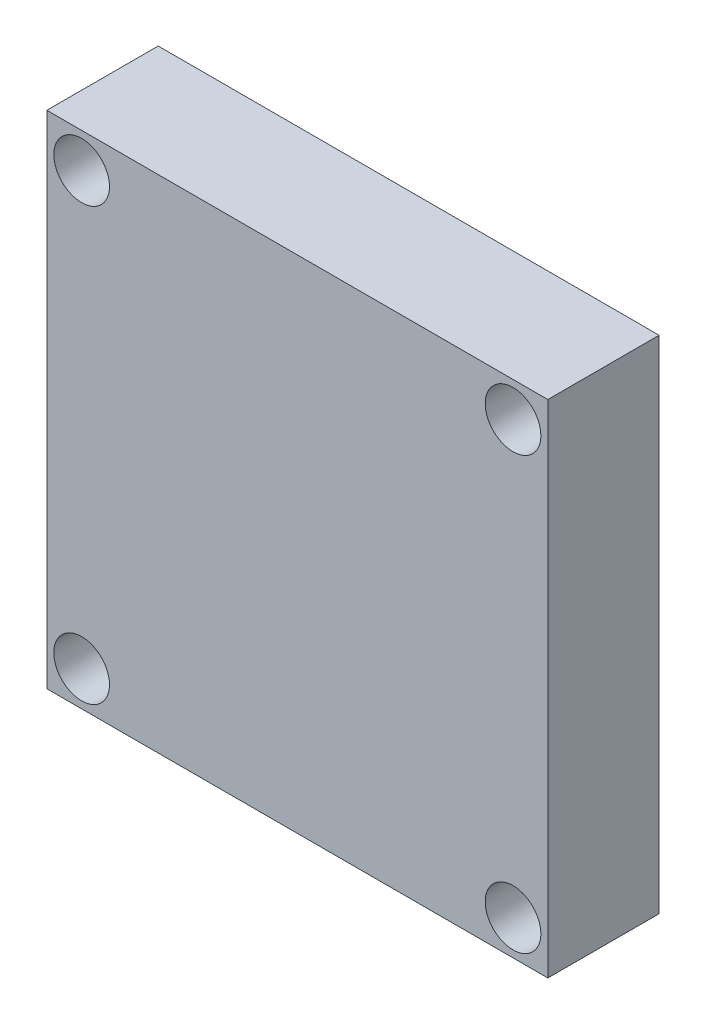
ISO-10303-21;
HEADER;
FILE_DESCRIPTION(('STEP AP214'),'2;1');
FILE_NAME('part.step','',(''),(''),'','','');
FILE_SCHEMA(('AUTOMOTIVE_DESIGN { 1 0 10303 214 1 1 1 1 }'));
ENDSEC;
DATA;
#1=APPLICATION_CONTEXT('core data for automotive mechanical design processes');
#2=APPLICATION_PROTOCOL_DEFINITION('international standard','automotive_design',2000,#1);
#3=PRODUCT_CONTEXT('',#1,'mechanical');
#4=PRODUCT('Part','Part','',(#3));
#5=PRODUCT_RELATED_PRODUCT_CATEGORY('part','',(#4));
#6=PRODUCT_DEFINITION_FORMATION('','',#4);
#7=PRODUCT_DEFINITION_CONTEXT('part definition',#1,'design');
#8=PRODUCT_DEFINITION('design','',#6,#7);
#9=PRODUCT_DEFINITION_SHAPE('','',#8);
#10=(LENGTH_UNIT() NAMED_UNIT(*) SI_UNIT(.MILLI.,.METRE.));
#11=(NAMED_UNIT(*) PLANE_ANGLE_UNIT() SI_UNIT($,.RADIAN.));
#12=(NAMED_UNIT(*) SI_UNIT($,.STERADIAN.) SOLID_ANGLE_UNIT());
#13=UNCERTAINTY_MEASURE_WITH_UNIT(LENGTH_MEASURE(1.E-05),#10,'distance_accuracy_value','');
#14=(GEOMETRIC_REPRESENTATION_CONTEXT(3) GLOBAL_UNCERTAINTY_ASSIGNED_CONTEXT((#13)) GLOBAL_UNIT_ASSIGNED_CONTEXT((#10,
#11,#12)) REPRESENTATION_CONTEXT('',''));
#15=CARTESIAN_POINT('',(0.,0.,0.));
#16=DIRECTION('',(0.,0.,1.));
#17=DIRECTION('',(1.,0.,0.));
#18=AXIS2_PLACEMENT_3D('',#15,#16,#17);
#19=CARTESIAN_POINT('',(0.,-18.,4.));
#20=DIRECTION('',(0.,1.,0.));
#21=DIRECTION('',(0.,0.,1.));
#22=AXIS2_PLACEMENT_3D('',#19,#20,#21);
#23=PLANE('',#22);
#24=DIRECTION('',(1.,0.,0.));
#25=VECTOR('',#24,1.);
#26=CARTESIAN_POINT('',(0.,-18.,-4.));
#27=LINE('',#26,#25);
#28=CARTESIAN_POINT('',(-18.,-18.,-4.));
#29=VERTEX_POINT('',#28);
#30=CARTESIAN_POINT('',(18.,-18.,-4.));
#31=VERTEX_POINT('',#30);
#32=EDGE_CURVE('E118',#29,#31,#27,.T.);
#33=ORIENTED_EDGE('',*,*,#32,.T.);
#34=DIRECTION('',(0.,0.,-1.));
#35=VECTOR('',#34,1.);
#36=CARTESIAN_POINT('',(18.,-18.,4.));
#37=LINE('',#36,#35);
#38=CARTESIAN_POINT('',(18.,-18.,4.));
#39=VERTEX_POINT('',#38);
#40=EDGE_CURVE('E11',#39,#31,#37,.T.);
#41=ORIENTED_EDGE('',*,*,#40,.F.);
#42=DIRECTION('',(1.,0.,0.));
#43=VECTOR('',#42,1.);
#44=CARTESIAN_POINT('',(0.,-18.,4.));
#45=LINE('',#44,#43);
#46=CARTESIAN_POINT('',(-18.,-18.,4.));
#47=VERTEX_POINT('',#46);
#48=EDGE_CURVE('E91',#47,#39,#45,.T.);
#49=ORIENTED_EDGE('',*,*,#48,.F.);
#50=DIRECTION('',(0.,0.,-1.));
#51=VECTOR('',#50,1.);
#52=CARTESIAN_POINT('',(-18.,-18.,4.));
#53=LINE('',#52,#51);
#54=EDGE_CURVE('E58',#47,#29,#53,.T.);
#55=ORIENTED_EDGE('',*,*,#54,.T.);
#56=EDGE_LOOP('',(#33,#41,#49,#55));
#57=FACE_BOUND('',#56,.T.);
#58=ADVANCED_FACE('F43',(#57),#23,.F.);
#59=CARTESIAN_POINT('',(18.,0.,4.));
#60=DIRECTION('',(-1.,0.,0.));
#61=DIRECTION('',(0.,-1.,0.));
#62=AXIS2_PLACEMENT_3D('',#59,#60,#61);
#63=PLANE('',#62);
#64=DIRECTION('',(0.,1.,0.));
#65=VECTOR('',#64,1.);
#66=CARTESIAN_POINT('',(18.,0.,-4.));
#67=LINE('',#66,#65);
#68=CARTESIAN_POINT('',(18.,18.,-4.));
#69=VERTEX_POINT('',#68);
#70=EDGE_CURVE('E98',#31,#69,#67,.T.);
#71=ORIENTED_EDGE('',*,*,#70,.T.);
#72=DIRECTION('',(0.,0.,-1.));
#73=VECTOR('',#72,1.);
#74=CARTESIAN_POINT('',(18.,18.,4.));
#75=LINE('',#74,#73);
#76=CARTESIAN_POINT('',(18.,18.,4.));
#77=VERTEX_POINT('',#76);
#78=EDGE_CURVE('E55',#77,#69,#75,.T.);
#79=ORIENTED_EDGE('',*,*,#78,.F.);
#80=DIRECTION('',(0.,1.,0.));
#81=VECTOR('',#80,1.);
#82=CARTESIAN_POINT('',(18.,0.,4.));
#83=LINE('',#82,#81);
#84=EDGE_CURVE('E82',#39,#77,#83,.T.);
#85=ORIENTED_EDGE('',*,*,#84,.F.);
#86=ORIENTED_EDGE('',*,*,#40,.T.);
#87=EDGE_LOOP('',(#71,#79,#85,#86));
#88=FACE_BOUND('',#87,.T.);
#89=ADVANCED_FACE('F100',(#88),#63,.F.);
#90=CARTESIAN_POINT('',(0.,18.,4.));
#91=DIRECTION('',(0.,1.,0.));
#92=DIRECTION('',(0.,0.,1.));
#93=AXIS2_PLACEMENT_3D('',#90,#91,#92);
#94=PLANE('',#93);
#95=DIRECTION('',(1.,0.,0.));
#96=VECTOR('',#95,1.);
#97=CARTESIAN_POINT('',(0.,18.,-4.));
#98=LINE('',#97,#96);
#99=CARTESIAN_POINT('',(-18.,18.,-4.));
#100=VERTEX_POINT('',#99);
#101=EDGE_CURVE('E121',#100,#69,#98,.T.);
#102=ORIENTED_EDGE('',*,*,#101,.F.);
#103=DIRECTION('',(0.,0.,-1.));
#104=VECTOR('',#103,1.);
#105=CARTESIAN_POINT('',(-18.,18.,4.));
#106=LINE('',#105,#104);
#107=CARTESIAN_POINT('',(-18.,18.,4.));
#108=VERTEX_POINT('',#107);
#109=EDGE_CURVE('E74',#108,#100,#106,.T.);
#110=ORIENTED_EDGE('',*,*,#109,.F.);
#111=DIRECTION('',(1.,0.,0.));
#112=VECTOR('',#111,1.);
#113=CARTESIAN_POINT('',(0.,18.,4.));
#114=LINE('',#113,#112);
#115=EDGE_CURVE('E95',#108,#77,#114,.T.);
#116=ORIENTED_EDGE('',*,*,#115,.T.);
#117=ORIENTED_EDGE('',*,*,#78,.T.);
#118=EDGE_LOOP('',(#102,#110,#116,#117));
#119=FACE_BOUND('',#118,.T.);
#120=ADVANCED_FACE('F101',(#119),#94,.T.);
#121=CARTESIAN_POINT('',(-15.5,15.5,4.));
#122=DIRECTION('',(0.,0.,-1.));
#123=DIRECTION('',(-1.,0.,0.));
#124=AXIS2_PLACEMENT_3D('',#121,#122,#123);
#125=CYLINDRICAL_SURFACE('',#124,2.);
#126=CARTESIAN_POINT('',(-15.5,15.5,4.));
#127=DIRECTION('',(0.,0.,1.));
#128=DIRECTION('',(1.,0.,0.));
#129=AXIS2_PLACEMENT_3D('',#126,#127,#128);
#130=CIRCLE('',#129,2.);
#131=CARTESIAN_POINT('',(-13.5,15.5,4.));
#132=VERTEX_POINT('',#131);
#133=EDGE_CURVE('E143',#132,#132,#130,.T.);
#134=ORIENTED_EDGE('',*,*,#133,.T.);
#135=EDGE_LOOP('',(#134));
#136=FACE_BOUND('',#135,.T.);
#137=CARTESIAN_POINT('',(-15.5,15.5,-4.));
#138=DIRECTION('',(0.,0.,1.));
#139=DIRECTION('',(1.,0.,0.));
#140=AXIS2_PLACEMENT_3D('',#137,#138,#139);
#141=CIRCLE('',#140,2.);
#142=CARTESIAN_POINT('',(-13.5,15.5,-4.));
#143=VERTEX_POINT('',#142);
#144=EDGE_CURVE('E119',#143,#143,#141,.T.);
#145=ORIENTED_EDGE('',*,*,#144,.F.);
#146=EDGE_LOOP('',(#145));
#147=FACE_BOUND('',#146,.T.);
#148=ADVANCED_FACE('F144',(#136,#147),#125,.F.);
#149=CARTESIAN_POINT('',(15.5,15.5,4.));
#150=DIRECTION('',(0.,0.,-1.));
#151=DIRECTION('',(-1.,0.,0.));
#152=AXIS2_PLACEMENT_3D('',#149,#150,#151);
#153=CYLINDRICAL_SURFACE('',#152,2.00000000000001);
#154=CARTESIAN_POINT('',(15.5,15.5,4.));
#155=DIRECTION('',(0.,0.,1.));
#156=DIRECTION('',(1.,0.,0.));
#157=AXIS2_PLACEMENT_3D('',#154,#155,#156);
#158=CIRCLE('',#157,2.00000000000001);
#159=CARTESIAN_POINT('',(17.5,15.5,4.));
#160=VERTEX_POINT('',#159);
#161=EDGE_CURVE('E139',#160,#160,#158,.T.);
#162=ORIENTED_EDGE('',*,*,#161,.T.);
#163=EDGE_LOOP('',(#162));
#164=FACE_BOUND('',#163,.T.);
#165=CARTESIAN_POINT('',(15.5,15.5,-4.));
#166=DIRECTION('',(0.,0.,1.));
#167=DIRECTION('',(1.,0.,0.));
#168=AXIS2_PLACEMENT_3D('',#165,#166,#167);
#169=CIRCLE('',#168,2.00000000000001);
#170=CARTESIAN_POINT('',(17.5,15.5,-4.));
#171=VERTEX_POINT('',#170);
#172=EDGE_CURVE('E114',#171,#171,#169,.T.);
#173=ORIENTED_EDGE('',*,*,#172,.F.);
#174=EDGE_LOOP('',(#173));
#175=FACE_BOUND('',#174,.T.);
#176=ADVANCED_FACE('F174',(#164,#175),#153,.F.);
#177=CARTESIAN_POINT('',(15.5,-15.5,4.));
#178=DIRECTION('',(0.,0.,-1.));
#179=DIRECTION('',(-1.,0.,0.));
#180=AXIS2_PLACEMENT_3D('',#177,#178,#179);
#181=CYLINDRICAL_SURFACE('',#180,2.00000000000001);
#182=CARTESIAN_POINT('',(15.5,-15.5,4.));
#183=DIRECTION('',(0.,0.,1.));
#184=DIRECTION('',(1.,0.,0.));
#185=AXIS2_PLACEMENT_3D('',#182,#183,#184);
#186=CIRCLE('',#185,2.00000000000001);
#187=CARTESIAN_POINT('',(17.5,-15.5,4.));
#188=VERTEX_POINT('',#187);
#189=EDGE_CURVE('E134',#188,#188,#186,.T.);
#190=ORIENTED_EDGE('',*,*,#189,.T.);
#191=EDGE_LOOP('',(#190));
#192=FACE_BOUND('',#191,.T.);
#193=CARTESIAN_POINT('',(15.5,-15.5,-4.));
#194=DIRECTION('',(0.,0.,1.));
#195=DIRECTION('',(1.,0.,0.));
#196=AXIS2_PLACEMENT_3D('',#193,#194,#195);
#197=CIRCLE('',#196,2.00000000000001);
#198=CARTESIAN_POINT('',(17.5,-15.5,-4.));
#199=VERTEX_POINT('',#198);
#200=EDGE_CURVE('E109',#199,#199,#197,.T.);
#201=ORIENTED_EDGE('',*,*,#200,.F.);
#202=EDGE_LOOP('',(#201));
#203=FACE_BOUND('',#202,.T.);
#204=ADVANCED_FACE('F175',(#192,#203),#181,.F.);
#205=CARTESIAN_POINT('',(-15.5,-15.5,4.));
#206=DIRECTION('',(0.,0.,-1.));
#207=DIRECTION('',(-1.,0.,0.));
#208=AXIS2_PLACEMENT_3D('',#205,#206,#207);
#209=CYLINDRICAL_SURFACE('',#208,2.);
#210=CARTESIAN_POINT('',(-15.5,-15.5,4.));
#211=DIRECTION('',(0.,0.,1.));
#212=DIRECTION('',(1.,0.,0.));
#213=AXIS2_PLACEMENT_3D('',#210,#211,#212);
#214=CIRCLE('',#213,2.);
#215=CARTESIAN_POINT('',(-13.5,-15.5,4.));
#216=VERTEX_POINT('',#215);
#217=EDGE_CURVE('E130',#216,#216,#214,.T.);
#218=ORIENTED_EDGE('',*,*,#217,.T.);
#219=EDGE_LOOP('',(#218));
#220=FACE_BOUND('',#219,.T.);
#221=CARTESIAN_POINT('',(-15.5,-15.5,-4.));
#222=DIRECTION('',(0.,0.,1.));
#223=DIRECTION('',(1.,0.,0.));
#224=AXIS2_PLACEMENT_3D('',#221,#222,#223);
#225=CIRCLE('',#224,2.);
#226=CARTESIAN_POINT('',(-13.5,-15.5,-4.));
#227=VERTEX_POINT('',#226);
#228=EDGE_CURVE('E110',#227,#227,#225,.T.);
#229=ORIENTED_EDGE('',*,*,#228,.F.);
#230=EDGE_LOOP('',(#229));
#231=FACE_BOUND('',#230,.T.);
#232=ADVANCED_FACE('F44',(#220,#231),#209,.F.);
#233=CARTESIAN_POINT('',(-18.,0.,4.));
#234=DIRECTION('',(-1.,0.,0.));
#235=DIRECTION('',(0.,-1.,0.));
#236=AXIS2_PLACEMENT_3D('',#233,#234,#235);
#237=PLANE('',#236);
#238=DIRECTION('',(0.,1.,0.));
#239=VECTOR('',#238,1.);
#240=CARTESIAN_POINT('',(-18.,0.,-4.));
#241=LINE('',#240,#239);
#242=EDGE_CURVE('E123',#29,#100,#241,.T.);
#243=ORIENTED_EDGE('',*,*,#242,.F.);
#244=ORIENTED_EDGE('',*,*,#54,.F.);
#245=DIRECTION('',(0.,1.,0.));
#246=VECTOR('',#245,1.);
#247=CARTESIAN_POINT('',(-18.,0.,4.));
#248=LINE('',#247,#246);
#249=EDGE_CURVE('E105',#47,#108,#248,.T.);
#250=ORIENTED_EDGE('',*,*,#249,.T.);
#251=ORIENTED_EDGE('',*,*,#109,.T.);
#252=EDGE_LOOP('',(#243,#244,#250,#251));
#253=FACE_BOUND('',#252,.T.);
#254=ADVANCED_FACE('F147',(#253),#237,.T.);
#255=CARTESIAN_POINT('',(0.,0.,4.));
#256=DIRECTION('',(0.,0.,1.));
#257=DIRECTION('',(1.,0.,0.));
#258=AXIS2_PLACEMENT_3D('',#255,#256,#257);
#259=PLANE('',#258);
#260=ORIENTED_EDGE('',*,*,#217,.F.);
#261=EDGE_LOOP('',(#260));
#262=FACE_BOUND('',#261,.T.);
#263=ORIENTED_EDGE('',*,*,#189,.F.);
#264=EDGE_LOOP('',(#263));
#265=FACE_BOUND('',#264,.T.);
#266=ORIENTED_EDGE('',*,*,#161,.F.);
#267=EDGE_LOOP('',(#266));
#268=FACE_BOUND('',#267,.T.);
#269=ORIENTED_EDGE('',*,*,#133,.F.);
#270=EDGE_LOOP('',(#269));
#271=FACE_BOUND('',#270,.T.);
#272=ORIENTED_EDGE('',*,*,#48,.T.);
#273=ORIENTED_EDGE('',*,*,#84,.T.);
#274=ORIENTED_EDGE('',*,*,#115,.F.);
#275=ORIENTED_EDGE('',*,*,#249,.F.);
#276=EDGE_LOOP('',(#272,#273,#274,#275));
#277=FACE_BOUND('',#276,.T.);
#278=ADVANCED_FACE('F90',(#262,#265,#268,#271,#277),#259,.T.);
#279=CARTESIAN_POINT('',(0.,0.,-4.));
#280=DIRECTION('',(0.,0.,1.));
#281=DIRECTION('',(1.,0.,0.));
#282=AXIS2_PLACEMENT_3D('',#279,#280,#281);
#283=PLANE('',#282);
#284=ORIENTED_EDGE('',*,*,#228,.T.);
#285=EDGE_LOOP('',(#284));
#286=FACE_BOUND('',#285,.T.);
#287=ORIENTED_EDGE('',*,*,#200,.T.);
#288=EDGE_LOOP('',(#287));
#289=FACE_BOUND('',#288,.T.);
#290=ORIENTED_EDGE('',*,*,#172,.T.);
#291=EDGE_LOOP('',(#290));
#292=FACE_BOUND('',#291,.T.);
#293=ORIENTED_EDGE('',*,*,#144,.T.);
#294=EDGE_LOOP('',(#293));
#295=FACE_BOUND('',#294,.T.);
#296=ORIENTED_EDGE('',*,*,#32,.F.);
#297=ORIENTED_EDGE('',*,*,#242,.T.);
#298=ORIENTED_EDGE('',*,*,#101,.T.);
#299=ORIENTED_EDGE('',*,*,#70,.F.);
#300=EDGE_LOOP('',(#296,#297,#298,#299));
#301=FACE_BOUND('',#300,.T.);
#302=ADVANCED_FACE('F149',(#286,#289,#292,#295,#301),#283,.F.);
#303=CLOSED_SHELL('',(#58,#89,#120,#148,#176,#204,#232,#254,#278,#302));
#304=MANIFOLD_SOLID_BREP('B2',#303);
#305=ADVANCED_BREP_SHAPE_REPRESENTATION('',(#18,#304),#14);
#306=SHAPE_DEFINITION_REPRESENTATION(#9,#305);
ENDSEC;
END-ISO-10303-21;
